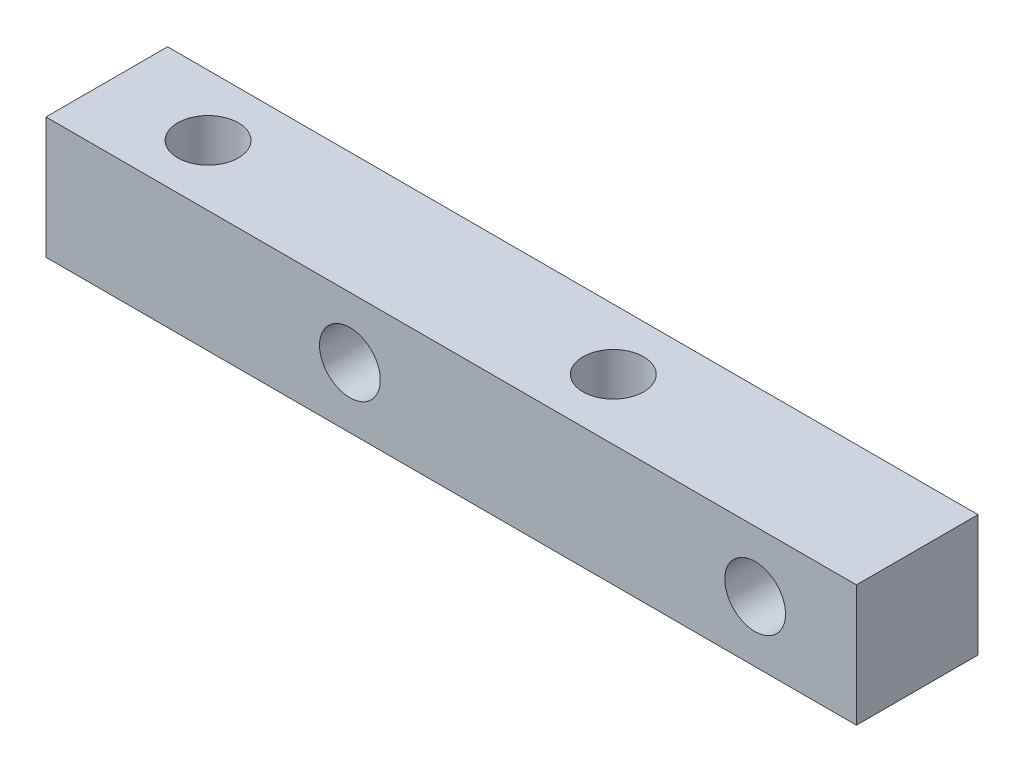
ISO-10303-21;
HEADER;
FILE_DESCRIPTION(('STEP AP214'),'2;1');
FILE_NAME('part.step','',(''),(''),'','','');
FILE_SCHEMA(('AUTOMOTIVE_DESIGN { 1 0 10303 214 1 1 1 1 }'));
ENDSEC;
DATA;
#1=APPLICATION_CONTEXT('core data for automotive mechanical design processes');
#2=APPLICATION_PROTOCOL_DEFINITION('international standard','automotive_design',2000,#1);
#3=PRODUCT_CONTEXT('',#1,'mechanical');
#4=PRODUCT('Part','Part','',(#3));
#5=PRODUCT_RELATED_PRODUCT_CATEGORY('part','',(#4));
#6=PRODUCT_DEFINITION_FORMATION('','',#4);
#7=PRODUCT_DEFINITION_CONTEXT('part definition',#1,'design');
#8=PRODUCT_DEFINITION('design','',#6,#7);
#9=PRODUCT_DEFINITION_SHAPE('','',#8);
#10=(LENGTH_UNIT() NAMED_UNIT(*) SI_UNIT(.MILLI.,.METRE.));
#11=(NAMED_UNIT(*) PLANE_ANGLE_UNIT() SI_UNIT($,.RADIAN.));
#12=(NAMED_UNIT(*) SI_UNIT($,.STERADIAN.) SOLID_ANGLE_UNIT());
#13=UNCERTAINTY_MEASURE_WITH_UNIT(LENGTH_MEASURE(1.E-05),#10,'distance_accuracy_value','');
#14=(GEOMETRIC_REPRESENTATION_CONTEXT(3) GLOBAL_UNCERTAINTY_ASSIGNED_CONTEXT((#13)) GLOBAL_UNIT_ASSIGNED_CONTEXT((#10,
#11,#12)) REPRESENTATION_CONTEXT('',''));
#15=CARTESIAN_POINT('',(0.,0.,0.));
#16=DIRECTION('',(0.,0.,1.));
#17=DIRECTION('',(1.,0.,0.));
#18=AXIS2_PLACEMENT_3D('',#15,#16,#17);
#19=CARTESIAN_POINT('',(20.,6.,-3.));
#20=DIRECTION('',(-1.,0.,0.));
#21=DIRECTION('',(0.,0.,1.));
#22=AXIS2_PLACEMENT_3D('',#19,#20,#21);
#23=PLANE('',#22);
#24=DIRECTION('',(0.,0.,-1.));
#25=VECTOR('',#24,1.);
#26=CARTESIAN_POINT('',(20.,0.,-3.));
#27=LINE('',#26,#25);
#28=CARTESIAN_POINT('',(20.,0.,3.));
#29=VERTEX_POINT('',#28);
#30=CARTESIAN_POINT('',(20.,0.,-3.));
#31=VERTEX_POINT('',#30);
#32=EDGE_CURVE('E102',#29,#31,#27,.T.);
#33=ORIENTED_EDGE('',*,*,#32,.T.);
#34=DIRECTION('',(0.,-1.,0.));
#35=VECTOR('',#34,1.);
#36=CARTESIAN_POINT('',(20.,6.,-3.));
#37=LINE('',#36,#35);
#38=CARTESIAN_POINT('',(20.,6.,-3.));
#39=VERTEX_POINT('',#38);
#40=EDGE_CURVE('E11',#39,#31,#37,.T.);
#41=ORIENTED_EDGE('',*,*,#40,.F.);
#42=DIRECTION('',(0.,0.,-1.));
#43=VECTOR('',#42,1.);
#44=CARTESIAN_POINT('',(20.,6.,-3.));
#45=LINE('',#44,#43);
#46=CARTESIAN_POINT('',(20.,6.,3.));
#47=VERTEX_POINT('',#46);
#48=EDGE_CURVE('E90',#47,#39,#45,.T.);
#49=ORIENTED_EDGE('',*,*,#48,.F.);
#50=DIRECTION('',(0.,-1.,0.));
#51=VECTOR('',#50,1.);
#52=CARTESIAN_POINT('',(20.,6.,3.));
#53=LINE('',#52,#51);
#54=EDGE_CURVE('E98',#47,#29,#53,.T.);
#55=ORIENTED_EDGE('',*,*,#54,.T.);
#56=EDGE_LOOP('',(#33,#41,#49,#55));
#57=FACE_BOUND('',#56,.T.);
#58=ADVANCED_FACE('F39',(#57),#23,.F.);
#59=CARTESIAN_POINT('',(-20.,6.,-3.));
#60=DIRECTION('',(0.,0.,1.));
#61=DIRECTION('',(1.,0.,0.));
#62=AXIS2_PLACEMENT_3D('',#59,#60,#61);
#63=PLANE('',#62);
#64=CARTESIAN_POINT('',(15.,3.,-3.));
#65=DIRECTION('',(0.,0.,-1.));
#66=DIRECTION('',(-1.,0.,0.));
#67=AXIS2_PLACEMENT_3D('',#64,#65,#66);
#68=CIRCLE('',#67,1.5);
#69=CARTESIAN_POINT('',(13.5,3.,-3.));
#70=VERTEX_POINT('',#69);
#71=EDGE_CURVE('E134',#70,#70,#68,.T.);
#72=ORIENTED_EDGE('',*,*,#71,.F.);
#73=EDGE_LOOP('',(#72));
#74=FACE_BOUND('',#73,.T.);
#75=CARTESIAN_POINT('',(-5.00000000000001,3.,-3.));
#76=DIRECTION('',(0.,0.,-1.));
#77=DIRECTION('',(-1.,0.,0.));
#78=AXIS2_PLACEMENT_3D('',#75,#76,#77);
#79=CIRCLE('',#78,1.5);
#80=CARTESIAN_POINT('',(-6.50000000000001,3.,-3.));
#81=VERTEX_POINT('',#80);
#82=EDGE_CURVE('E131',#81,#81,#79,.T.);
#83=ORIENTED_EDGE('',*,*,#82,.F.);
#84=EDGE_LOOP('',(#83));
#85=FACE_BOUND('',#84,.T.);
#86=DIRECTION('',(-1.,0.,0.));
#87=VECTOR('',#86,1.);
#88=CARTESIAN_POINT('',(-20.,0.,-3.));
#89=LINE('',#88,#87);
#90=CARTESIAN_POINT('',(-20.,0.,-3.));
#91=VERTEX_POINT('',#90);
#92=EDGE_CURVE('E94',#31,#91,#89,.T.);
#93=ORIENTED_EDGE('',*,*,#92,.T.);
#94=DIRECTION('',(0.,-1.,0.));
#95=VECTOR('',#94,1.);
#96=CARTESIAN_POINT('',(-20.,6.,-3.));
#97=LINE('',#96,#95);
#98=CARTESIAN_POINT('',(-20.,6.,-3.));
#99=VERTEX_POINT('',#98);
#100=EDGE_CURVE('E47',#99,#91,#97,.T.);
#101=ORIENTED_EDGE('',*,*,#100,.F.);
#102=DIRECTION('',(-1.,0.,0.));
#103=VECTOR('',#102,1.);
#104=CARTESIAN_POINT('',(-20.,6.,-3.));
#105=LINE('',#104,#103);
#106=EDGE_CURVE('E85',#39,#99,#105,.T.);
#107=ORIENTED_EDGE('',*,*,#106,.F.);
#108=ORIENTED_EDGE('',*,*,#40,.T.);
#109=EDGE_LOOP('',(#93,#101,#107,#108));
#110=FACE_BOUND('',#109,.T.);
#111=ADVANCED_FACE('F93',(#74,#85,#110),#63,.F.);
#112=CARTESIAN_POINT('',(-20.,6.,-3.));
#113=DIRECTION('',(1.,0.,0.));
#114=DIRECTION('',(0.,0.,-1.));
#115=AXIS2_PLACEMENT_3D('',#112,#113,#114);
#116=PLANE('',#115);
#117=DIRECTION('',(0.,0.,1.));
#118=VECTOR('',#117,1.);
#119=CARTESIAN_POINT('',(-20.,0.,-3.));
#120=LINE('',#119,#118);
#121=CARTESIAN_POINT('',(-20.,0.,3.));
#122=VERTEX_POINT('',#121);
#123=EDGE_CURVE('E72',#91,#122,#120,.T.);
#124=ORIENTED_EDGE('',*,*,#123,.T.);
#125=DIRECTION('',(0.,-1.,0.));
#126=VECTOR('',#125,1.);
#127=CARTESIAN_POINT('',(-20.,6.,3.));
#128=LINE('',#127,#126);
#129=CARTESIAN_POINT('',(-20.,6.,3.));
#130=VERTEX_POINT('',#129);
#131=EDGE_CURVE('E95',#130,#122,#128,.T.);
#132=ORIENTED_EDGE('',*,*,#131,.F.);
#133=DIRECTION('',(0.,0.,1.));
#134=VECTOR('',#133,1.);
#135=CARTESIAN_POINT('',(-20.,6.,-3.));
#136=LINE('',#135,#134);
#137=EDGE_CURVE('E88',#99,#130,#136,.T.);
#138=ORIENTED_EDGE('',*,*,#137,.F.);
#139=ORIENTED_EDGE('',*,*,#100,.T.);
#140=EDGE_LOOP('',(#124,#132,#138,#139));
#141=FACE_BOUND('',#140,.T.);
#142=ADVANCED_FACE('F96',(#141),#116,.F.);
#143=CARTESIAN_POINT('',(-20.,6.,3.));
#144=DIRECTION('',(0.,0.,-1.));
#145=DIRECTION('',(-1.,0.,0.));
#146=AXIS2_PLACEMENT_3D('',#143,#144,#145);
#147=PLANE('',#146);
#148=CARTESIAN_POINT('',(15.,3.,3.));
#149=DIRECTION('',(0.,0.,-1.));
#150=DIRECTION('',(-1.,0.,0.));
#151=AXIS2_PLACEMENT_3D('',#148,#149,#150);
#152=CIRCLE('',#151,1.5);
#153=CARTESIAN_POINT('',(13.5,3.,3.));
#154=VERTEX_POINT('',#153);
#155=EDGE_CURVE('E120',#154,#154,#152,.T.);
#156=ORIENTED_EDGE('',*,*,#155,.T.);
#157=EDGE_LOOP('',(#156));
#158=FACE_BOUND('',#157,.T.);
#159=CARTESIAN_POINT('',(-5.00000000000001,3.,3.));
#160=DIRECTION('',(0.,0.,-1.));
#161=DIRECTION('',(-1.,0.,0.));
#162=AXIS2_PLACEMENT_3D('',#159,#160,#161);
#163=CIRCLE('',#162,1.5);
#164=CARTESIAN_POINT('',(-6.50000000000001,3.,3.));
#165=VERTEX_POINT('',#164);
#166=EDGE_CURVE('E128',#165,#165,#163,.T.);
#167=ORIENTED_EDGE('',*,*,#166,.T.);
#168=EDGE_LOOP('',(#167));
#169=FACE_BOUND('',#168,.T.);
#170=DIRECTION('',(1.,0.,0.));
#171=VECTOR('',#170,1.);
#172=CARTESIAN_POINT('',(-20.,0.,3.));
#173=LINE('',#172,#171);
#174=EDGE_CURVE('E78',#122,#29,#173,.T.);
#175=ORIENTED_EDGE('',*,*,#174,.T.);
#176=ORIENTED_EDGE('',*,*,#54,.F.);
#177=DIRECTION('',(1.,0.,0.));
#178=VECTOR('',#177,1.);
#179=CARTESIAN_POINT('',(-20.,6.,3.));
#180=LINE('',#179,#178);
#181=EDGE_CURVE('E55',#130,#47,#180,.T.);
#182=ORIENTED_EDGE('',*,*,#181,.F.);
#183=ORIENTED_EDGE('',*,*,#131,.T.);
#184=EDGE_LOOP('',(#175,#176,#182,#183));
#185=FACE_BOUND('',#184,.T.);
#186=ADVANCED_FACE('F110',(#158,#169,#185),#147,.F.);
#187=CARTESIAN_POINT('',(0.,6.,0.));
#188=DIRECTION('',(0.,1.,0.));
#189=DIRECTION('',(0.,0.,1.));
#190=AXIS2_PLACEMENT_3D('',#187,#188,#189);
#191=PLANE('',#190);
#192=CARTESIAN_POINT('',(-15.,6.,0.));
#193=DIRECTION('',(0.,1.,0.));
#194=DIRECTION('',(0.,0.,1.));
#195=AXIS2_PLACEMENT_3D('',#192,#193,#194);
#196=CIRCLE('',#195,1.5);
#197=CARTESIAN_POINT('',(-15.,6.,1.5));
#198=VERTEX_POINT('',#197);
#199=EDGE_CURVE('E123',#198,#198,#196,.T.);
#200=ORIENTED_EDGE('',*,*,#199,.F.);
#201=EDGE_LOOP('',(#200));
#202=FACE_BOUND('',#201,.T.);
#203=CARTESIAN_POINT('',(5.00000000000001,6.,0.));
#204=DIRECTION('',(0.,1.,0.));
#205=DIRECTION('',(0.,0.,1.));
#206=AXIS2_PLACEMENT_3D('',#203,#204,#205);
#207=CIRCLE('',#206,1.5);
#208=CARTESIAN_POINT('',(5.00000000000001,6.,1.5));
#209=VERTEX_POINT('',#208);
#210=EDGE_CURVE('E119',#209,#209,#207,.T.);
#211=ORIENTED_EDGE('',*,*,#210,.F.);
#212=EDGE_LOOP('',(#211));
#213=FACE_BOUND('',#212,.T.);
#214=ORIENTED_EDGE('',*,*,#48,.T.);
#215=ORIENTED_EDGE('',*,*,#106,.T.);
#216=ORIENTED_EDGE('',*,*,#137,.T.);
#217=ORIENTED_EDGE('',*,*,#181,.T.);
#218=EDGE_LOOP('',(#214,#215,#216,#217));
#219=FACE_BOUND('',#218,.T.);
#220=ADVANCED_FACE('F86',(#202,#213,#219),#191,.T.);
#221=CARTESIAN_POINT('',(0.,0.,0.));
#222=DIRECTION('',(0.,1.,0.));
#223=DIRECTION('',(0.,0.,1.));
#224=AXIS2_PLACEMENT_3D('',#221,#222,#223);
#225=PLANE('',#224);
#226=CARTESIAN_POINT('',(-15.,0.,0.));
#227=DIRECTION('',(0.,1.,0.));
#228=DIRECTION('',(0.,0.,1.));
#229=AXIS2_PLACEMENT_3D('',#226,#227,#228);
#230=CIRCLE('',#229,1.5);
#231=CARTESIAN_POINT('',(-15.,0.,1.5));
#232=VERTEX_POINT('',#231);
#233=EDGE_CURVE('E105',#232,#232,#230,.T.);
#234=ORIENTED_EDGE('',*,*,#233,.T.);
#235=EDGE_LOOP('',(#234));
#236=FACE_BOUND('',#235,.T.);
#237=CARTESIAN_POINT('',(5.00000000000001,0.,0.));
#238=DIRECTION('',(0.,1.,0.));
#239=DIRECTION('',(0.,0.,1.));
#240=AXIS2_PLACEMENT_3D('',#237,#238,#239);
#241=CIRCLE('',#240,1.5);
#242=CARTESIAN_POINT('',(5.00000000000001,0.,1.5));
#243=VERTEX_POINT('',#242);
#244=EDGE_CURVE('E116',#243,#243,#241,.T.);
#245=ORIENTED_EDGE('',*,*,#244,.T.);
#246=EDGE_LOOP('',(#245));
#247=FACE_BOUND('',#246,.T.);
#248=ORIENTED_EDGE('',*,*,#32,.F.);
#249=ORIENTED_EDGE('',*,*,#174,.F.);
#250=ORIENTED_EDGE('',*,*,#123,.F.);
#251=ORIENTED_EDGE('',*,*,#92,.F.);
#252=EDGE_LOOP('',(#248,#249,#250,#251));
#253=FACE_BOUND('',#252,.T.);
#254=ADVANCED_FACE('F113',(#236,#247,#253),#225,.F.);
#255=CARTESIAN_POINT('',(5.00000000000001,0.,0.));
#256=DIRECTION('',(0.,1.,0.));
#257=DIRECTION('',(0.,0.,1.));
#258=AXIS2_PLACEMENT_3D('',#255,#256,#257);
#259=CYLINDRICAL_SURFACE('',#258,1.5);
#260=ORIENTED_EDGE('',*,*,#244,.F.);
#261=EDGE_LOOP('',(#260));
#262=FACE_BOUND('',#261,.T.);
#263=ORIENTED_EDGE('',*,*,#210,.T.);
#264=EDGE_LOOP('',(#263));
#265=FACE_BOUND('',#264,.T.);
#266=ADVANCED_FACE('F160',(#262,#265),#259,.F.);
#267=CARTESIAN_POINT('',(-15.,0.,0.));
#268=DIRECTION('',(0.,1.,0.));
#269=DIRECTION('',(0.,0.,1.));
#270=AXIS2_PLACEMENT_3D('',#267,#268,#269);
#271=CYLINDRICAL_SURFACE('',#270,1.5);
#272=ORIENTED_EDGE('',*,*,#233,.F.);
#273=EDGE_LOOP('',(#272));
#274=FACE_BOUND('',#273,.T.);
#275=ORIENTED_EDGE('',*,*,#199,.T.);
#276=EDGE_LOOP('',(#275));
#277=FACE_BOUND('',#276,.T.);
#278=ADVANCED_FACE('F154',(#274,#277),#271,.F.);
#279=CARTESIAN_POINT('',(-5.00000000000001,3.,3.));
#280=DIRECTION('',(0.,0.,-1.));
#281=DIRECTION('',(-1.,0.,0.));
#282=AXIS2_PLACEMENT_3D('',#279,#280,#281);
#283=CYLINDRICAL_SURFACE('',#282,1.5);
#284=ORIENTED_EDGE('',*,*,#166,.F.);
#285=EDGE_LOOP('',(#284));
#286=FACE_BOUND('',#285,.T.);
#287=ORIENTED_EDGE('',*,*,#82,.T.);
#288=EDGE_LOOP('',(#287));
#289=FACE_BOUND('',#288,.T.);
#290=ADVANCED_FACE('F145',(#286,#289),#283,.F.);
#291=CARTESIAN_POINT('',(15.,3.,3.));
#292=DIRECTION('',(0.,0.,-1.));
#293=DIRECTION('',(-1.,0.,0.));
#294=AXIS2_PLACEMENT_3D('',#291,#292,#293);
#295=CYLINDRICAL_SURFACE('',#294,1.5);
#296=ORIENTED_EDGE('',*,*,#155,.F.);
#297=EDGE_LOOP('',(#296));
#298=FACE_BOUND('',#297,.T.);
#299=ORIENTED_EDGE('',*,*,#71,.T.);
#300=EDGE_LOOP('',(#299));
#301=FACE_BOUND('',#300,.T.);
#302=ADVANCED_FACE('F142',(#298,#301),#295,.F.);
#303=CLOSED_SHELL('',(#58,#111,#142,#186,#220,#254,#266,#278,#290,#302));
#304=MANIFOLD_SOLID_BREP('B2',#303);
#305=ADVANCED_BREP_SHAPE_REPRESENTATION('',(#18,#304),#14);
#306=SHAPE_DEFINITION_REPRESENTATION(#9,#305);
ENDSEC;
END-ISO-10303-21;
